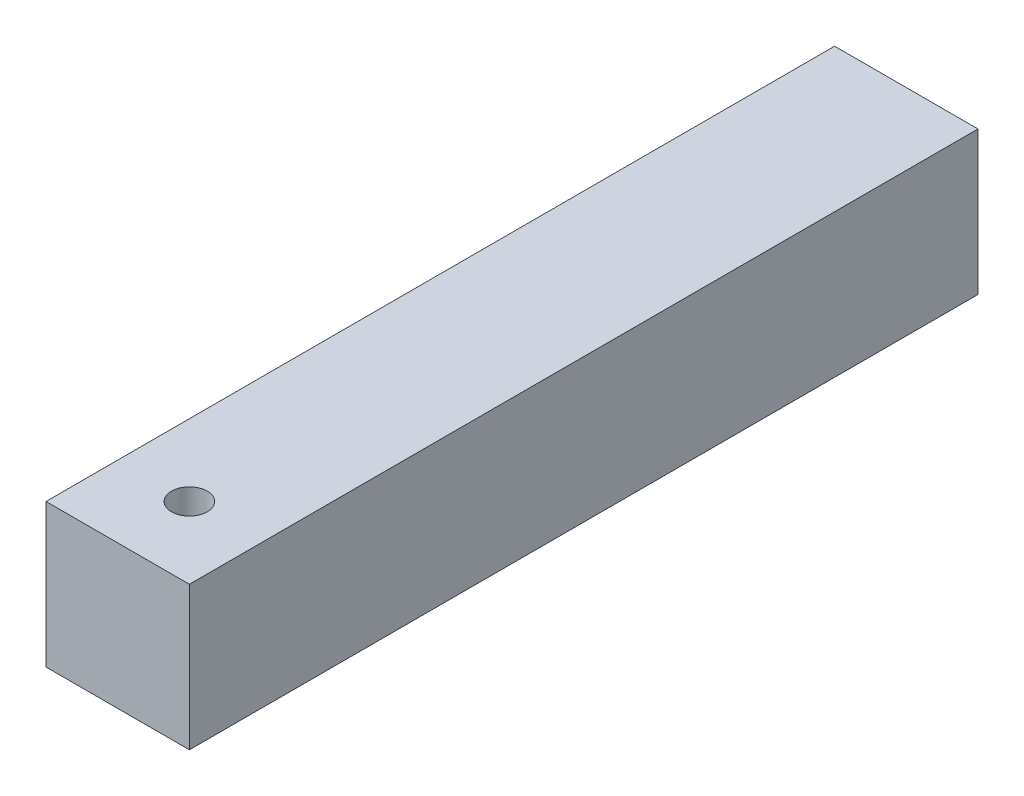
ISO-10303-21;
HEADER;
FILE_DESCRIPTION(('STEP AP214'),'2;1');
FILE_NAME('part.step','',(''),(''),'','','');
FILE_SCHEMA(('AUTOMOTIVE_DESIGN { 1 0 10303 214 1 1 1 1 }'));
ENDSEC;
DATA;
#1=APPLICATION_CONTEXT('core data for automotive mechanical design processes');
#2=APPLICATION_PROTOCOL_DEFINITION('international standard','automotive_design',2000,#1);
#3=PRODUCT_CONTEXT('',#1,'mechanical');
#4=PRODUCT('Part','Part','',(#3));
#5=PRODUCT_RELATED_PRODUCT_CATEGORY('part','',(#4));
#6=PRODUCT_DEFINITION_FORMATION('','',#4);
#7=PRODUCT_DEFINITION_CONTEXT('part definition',#1,'design');
#8=PRODUCT_DEFINITION('design','',#6,#7);
#9=PRODUCT_DEFINITION_SHAPE('','',#8);
#10=(LENGTH_UNIT() NAMED_UNIT(*) SI_UNIT(.MILLI.,.METRE.));
#11=(NAMED_UNIT(*) PLANE_ANGLE_UNIT() SI_UNIT($,.RADIAN.));
#12=(NAMED_UNIT(*) SI_UNIT($,.STERADIAN.) SOLID_ANGLE_UNIT());
#13=UNCERTAINTY_MEASURE_WITH_UNIT(LENGTH_MEASURE(1.E-05),#10,'distance_accuracy_value','');
#14=(GEOMETRIC_REPRESENTATION_CONTEXT(3) GLOBAL_UNCERTAINTY_ASSIGNED_CONTEXT((#13)) GLOBAL_UNIT_ASSIGNED_CONTEXT((#10,
#11,#12)) REPRESENTATION_CONTEXT('',''));
#15=CARTESIAN_POINT('',(0.,0.,0.));
#16=DIRECTION('',(0.,0.,1.));
#17=DIRECTION('',(1.,0.,0.));
#18=AXIS2_PLACEMENT_3D('',#15,#16,#17);
#19=CARTESIAN_POINT('',(-50.,50.,-550.));
#20=DIRECTION('',(-1.,0.,0.));
#21=DIRECTION('',(0.,-1.,0.));
#22=AXIS2_PLACEMENT_3D('',#19,#20,#21);
#23=PLANE('',#22);
#24=DIRECTION('',(0.,-1.,0.));
#25=VECTOR('',#24,1.);
#26=CARTESIAN_POINT('',(-50.,50.,0.));
#27=LINE('',#26,#25);
#28=CARTESIAN_POINT('',(-50.,50.,0.));
#29=VERTEX_POINT('',#28);
#30=CARTESIAN_POINT('',(-50.,-50.,0.));
#31=VERTEX_POINT('',#30);
#32=EDGE_CURVE('E118',#29,#31,#27,.T.);
#33=ORIENTED_EDGE('',*,*,#32,.F.);
#34=DIRECTION('',(0.,0.,1.));
#35=VECTOR('',#34,1.);
#36=CARTESIAN_POINT('',(-50.,50.,-550.));
#37=LINE('',#36,#35);
#38=CARTESIAN_POINT('',(-50.,50.,-550.));
#39=VERTEX_POINT('',#38);
#40=EDGE_CURVE('E11',#39,#29,#37,.T.);
#41=ORIENTED_EDGE('',*,*,#40,.F.);
#42=DIRECTION('',(0.,-1.,0.));
#43=VECTOR('',#42,1.);
#44=CARTESIAN_POINT('',(-50.,50.,-550.));
#45=LINE('',#44,#43);
#46=CARTESIAN_POINT('',(-50.,-50.,-550.));
#47=VERTEX_POINT('',#46);
#48=EDGE_CURVE('E109',#39,#47,#45,.T.);
#49=ORIENTED_EDGE('',*,*,#48,.T.);
#50=DIRECTION('',(0.,0.,1.));
#51=VECTOR('',#50,1.);
#52=CARTESIAN_POINT('',(-50.,-50.,-550.));
#53=LINE('',#52,#51);
#54=EDGE_CURVE('E89',#47,#31,#53,.T.);
#55=ORIENTED_EDGE('',*,*,#54,.T.);
#56=EDGE_LOOP('',(#33,#41,#49,#55));
#57=FACE_BOUND('',#56,.T.);
#58=ADVANCED_FACE('F45',(#57),#23,.T.);
#59=CARTESIAN_POINT('',(50.,50.,-550.));
#60=DIRECTION('',(0.,1.,0.));
#61=DIRECTION('',(-1.,0.,0.));
#62=AXIS2_PLACEMENT_3D('',#59,#60,#61);
#63=PLANE('',#62);
#64=CARTESIAN_POINT('',(0.,50.,-50.));
#65=DIRECTION('',(0.,1.,0.));
#66=DIRECTION('',(-1.,0.,0.));
#67=AXIS2_PLACEMENT_3D('',#64,#65,#66);
#68=CIRCLE('',#67,12.5);
#69=CARTESIAN_POINT('',(-12.4999999999999,50.,-50.));
#70=VERTEX_POINT('',#69);
#71=EDGE_CURVE('E157',#70,#70,#68,.T.);
#72=ORIENTED_EDGE('',*,*,#71,.F.);
#73=EDGE_LOOP('',(#72));
#74=FACE_BOUND('',#73,.T.);
#75=DIRECTION('',(-1.,0.,0.));
#76=VECTOR('',#75,1.);
#77=CARTESIAN_POINT('',(50.,50.,0.));
#78=LINE('',#77,#76);
#79=CARTESIAN_POINT('',(50.,50.,0.));
#80=VERTEX_POINT('',#79);
#81=EDGE_CURVE('E112',#80,#29,#78,.T.);
#82=ORIENTED_EDGE('',*,*,#81,.F.);
#83=DIRECTION('',(0.,0.,1.));
#84=VECTOR('',#83,1.);
#85=CARTESIAN_POINT('',(50.,50.,-550.));
#86=LINE('',#85,#84);
#87=CARTESIAN_POINT('',(50.,50.,-550.));
#88=VERTEX_POINT('',#87);
#89=EDGE_CURVE('E55',#88,#80,#86,.T.);
#90=ORIENTED_EDGE('',*,*,#89,.F.);
#91=DIRECTION('',(-1.,0.,0.));
#92=VECTOR('',#91,1.);
#93=CARTESIAN_POINT('',(50.,50.,-550.));
#94=LINE('',#93,#92);
#95=EDGE_CURVE('E104',#88,#39,#94,.T.);
#96=ORIENTED_EDGE('',*,*,#95,.T.);
#97=ORIENTED_EDGE('',*,*,#40,.T.);
#98=EDGE_LOOP('',(#82,#90,#96,#97));
#99=FACE_BOUND('',#98,.T.);
#100=ADVANCED_FACE('F134',(#74,#99),#63,.T.);
#101=CARTESIAN_POINT('',(50.,50.,-550.));
#102=DIRECTION('',(1.,0.,0.));
#103=DIRECTION('',(0.,1.,0.));
#104=AXIS2_PLACEMENT_3D('',#101,#102,#103);
#105=PLANE('',#104);
#106=DIRECTION('',(0.,1.,0.));
#107=VECTOR('',#106,1.);
#108=CARTESIAN_POINT('',(50.,50.,0.));
#109=LINE('',#108,#107);
#110=CARTESIAN_POINT('',(50.,-50.,0.));
#111=VERTEX_POINT('',#110);
#112=EDGE_CURVE('E97',#111,#80,#109,.T.);
#113=ORIENTED_EDGE('',*,*,#112,.F.);
#114=DIRECTION('',(0.,0.,1.));
#115=VECTOR('',#114,1.);
#116=CARTESIAN_POINT('',(50.,-50.,-550.));
#117=LINE('',#116,#115);
#118=CARTESIAN_POINT('',(50.,-50.,-550.));
#119=VERTEX_POINT('',#118);
#120=EDGE_CURVE('E92',#119,#111,#117,.T.);
#121=ORIENTED_EDGE('',*,*,#120,.F.);
#122=DIRECTION('',(0.,1.,0.));
#123=VECTOR('',#122,1.);
#124=CARTESIAN_POINT('',(50.,50.,-550.));
#125=LINE('',#124,#123);
#126=EDGE_CURVE('E95',#119,#88,#125,.T.);
#127=ORIENTED_EDGE('',*,*,#126,.T.);
#128=ORIENTED_EDGE('',*,*,#89,.T.);
#129=EDGE_LOOP('',(#113,#121,#127,#128));
#130=FACE_BOUND('',#129,.T.);
#131=ADVANCED_FACE('F94',(#130),#105,.T.);
#132=CARTESIAN_POINT('',(50.,-50.,-550.));
#133=DIRECTION('',(0.,-1.,0.));
#134=DIRECTION('',(1.,0.,0.));
#135=AXIS2_PLACEMENT_3D('',#132,#133,#134);
#136=PLANE('',#135);
#137=CARTESIAN_POINT('',(0.,-50.,-50.));
#138=DIRECTION('',(0.,-1.,0.));
#139=DIRECTION('',(1.,0.,0.));
#140=AXIS2_PLACEMENT_3D('',#137,#138,#139);
#141=CIRCLE('',#140,12.5);
#142=CARTESIAN_POINT('',(12.5000000000001,-50.,-50.));
#143=VERTEX_POINT('',#142);
#144=EDGE_CURVE('E48',#143,#143,#141,.T.);
#145=ORIENTED_EDGE('',*,*,#144,.F.);
#146=EDGE_LOOP('',(#145));
#147=FACE_BOUND('',#146,.T.);
#148=DIRECTION('',(1.,0.,0.));
#149=VECTOR('',#148,1.);
#150=CARTESIAN_POINT('',(50.,-50.,0.));
#151=LINE('',#150,#149);
#152=EDGE_CURVE('E122',#31,#111,#151,.T.);
#153=ORIENTED_EDGE('',*,*,#152,.F.);
#154=ORIENTED_EDGE('',*,*,#54,.F.);
#155=DIRECTION('',(1.,0.,0.));
#156=VECTOR('',#155,1.);
#157=CARTESIAN_POINT('',(50.,-50.,-550.));
#158=LINE('',#157,#156);
#159=EDGE_CURVE('E103',#47,#119,#158,.T.);
#160=ORIENTED_EDGE('',*,*,#159,.T.);
#161=ORIENTED_EDGE('',*,*,#120,.T.);
#162=EDGE_LOOP('',(#153,#154,#160,#161));
#163=FACE_BOUND('',#162,.T.);
#164=ADVANCED_FACE('F107',(#147,#163),#136,.T.);
#165=CARTESIAN_POINT('',(0.,0.,-550.));
#166=DIRECTION('',(0.,0.,-1.));
#167=DIRECTION('',(-1.,0.,0.));
#168=AXIS2_PLACEMENT_3D('',#165,#166,#167);
#169=PLANE('',#168);
#170=ORIENTED_EDGE('',*,*,#48,.F.);
#171=ORIENTED_EDGE('',*,*,#95,.F.);
#172=ORIENTED_EDGE('',*,*,#126,.F.);
#173=ORIENTED_EDGE('',*,*,#159,.F.);
#174=EDGE_LOOP('',(#170,#171,#172,#173));
#175=FACE_BOUND('',#174,.T.);
#176=ADVANCED_FACE('F102',(#175),#169,.T.);
#177=CARTESIAN_POINT('',(0.,0.,0.));
#178=DIRECTION('',(0.,0.,-1.));
#179=DIRECTION('',(-1.,0.,0.));
#180=AXIS2_PLACEMENT_3D('',#177,#178,#179);
#181=PLANE('',#180);
#182=ORIENTED_EDGE('',*,*,#32,.T.);
#183=ORIENTED_EDGE('',*,*,#152,.T.);
#184=ORIENTED_EDGE('',*,*,#112,.T.);
#185=ORIENTED_EDGE('',*,*,#81,.T.);
#186=EDGE_LOOP('',(#182,#183,#184,#185));
#187=FACE_BOUND('',#186,.T.);
#188=ADVANCED_FACE('F133',(#187),#181,.F.);
#189=CARTESIAN_POINT('',(0.,-450.,-50.));
#190=DIRECTION('',(0.,1.,0.));
#191=DIRECTION('',(-1.,0.,0.));
#192=AXIS2_PLACEMENT_3D('',#189,#190,#191);
#193=CYLINDRICAL_SURFACE('',#192,12.5);
#194=ORIENTED_EDGE('',*,*,#144,.T.);
#195=EDGE_LOOP('',(#194));
#196=FACE_BOUND('',#195,.T.);
#197=ORIENTED_EDGE('',*,*,#71,.T.);
#198=EDGE_LOOP('',(#197));
#199=FACE_BOUND('',#198,.T.);
#200=ADVANCED_FACE('F161',(#196,#199),#193,.F.);
#201=CLOSED_SHELL('',(#58,#100,#131,#164,#176,#188,#200));
#202=MANIFOLD_SOLID_BREP('B2',#201);
#203=ADVANCED_BREP_SHAPE_REPRESENTATION('',(#18,#202),#14);
#204=SHAPE_DEFINITION_REPRESENTATION(#9,#203);
ENDSEC;
END-ISO-10303-21;
